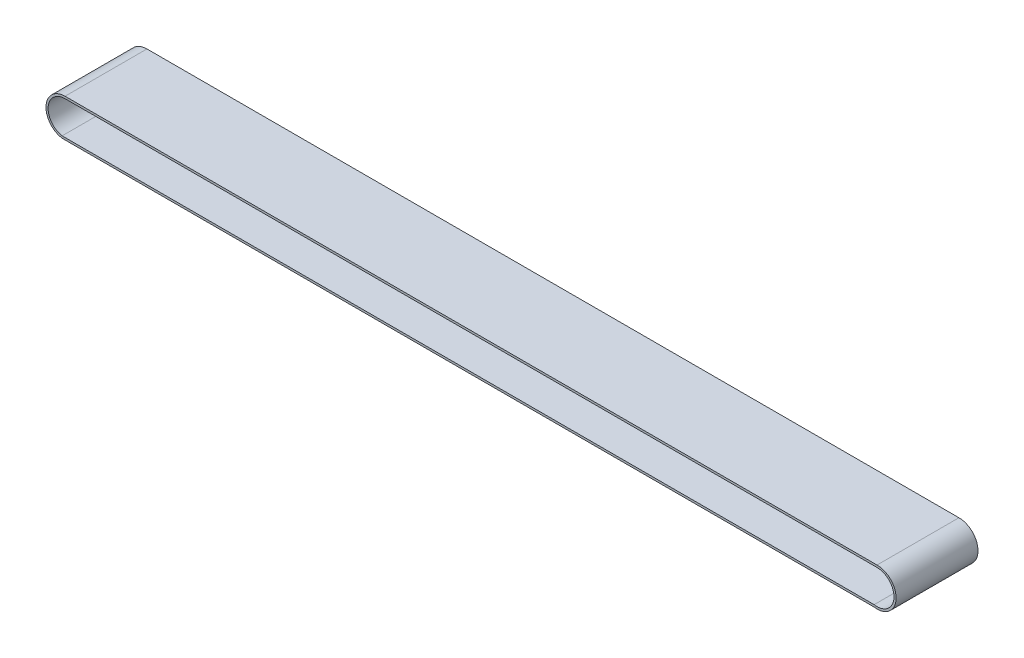
ISO-10303-21;
HEADER;
FILE_DESCRIPTION(('STEP AP214'),'2;1');
FILE_NAME('part.step','',(''),(''),'','','');
FILE_SCHEMA(('AUTOMOTIVE_DESIGN { 1 0 10303 214 1 1 1 1 }'));
ENDSEC;
DATA;
#1=APPLICATION_CONTEXT('core data for automotive mechanical design processes');
#2=APPLICATION_PROTOCOL_DEFINITION('international standard','automotive_design',2000,#1);
#3=PRODUCT_CONTEXT('',#1,'mechanical');
#4=PRODUCT('Part','Part','',(#3));
#5=PRODUCT_RELATED_PRODUCT_CATEGORY('part','',(#4));
#6=PRODUCT_DEFINITION_FORMATION('','',#4);
#7=PRODUCT_DEFINITION_CONTEXT('part definition',#1,'design');
#8=PRODUCT_DEFINITION('design','',#6,#7);
#9=PRODUCT_DEFINITION_SHAPE('','',#8);
#10=(LENGTH_UNIT() NAMED_UNIT(*) SI_UNIT(.MILLI.,.METRE.));
#11=(NAMED_UNIT(*) PLANE_ANGLE_UNIT() SI_UNIT($,.RADIAN.));
#12=(NAMED_UNIT(*) SI_UNIT($,.STERADIAN.) SOLID_ANGLE_UNIT());
#13=UNCERTAINTY_MEASURE_WITH_UNIT(LENGTH_MEASURE(1.E-05),#10,'distance_accuracy_value','');
#14=(GEOMETRIC_REPRESENTATION_CONTEXT(3) GLOBAL_UNCERTAINTY_ASSIGNED_CONTEXT((#13)) GLOBAL_UNIT_ASSIGNED_CONTEXT((#10,
#11,#12)) REPRESENTATION_CONTEXT('',''));
#15=CARTESIAN_POINT('',(0.,0.,0.));
#16=DIRECTION('',(0.,0.,1.));
#17=DIRECTION('',(1.,0.,0.));
#18=AXIS2_PLACEMENT_3D('',#15,#16,#17);
#19=CARTESIAN_POINT('',(288.592886812432,-0.0890617466296167,29.));
#20=DIRECTION('',(0.,0.,-1.));
#21=DIRECTION('',(-1.,0.,0.));
#22=AXIS2_PLACEMENT_3D('',#19,#20,#21);
#23=CYLINDRICAL_SURFACE('',#22,13.5);
#24=CARTESIAN_POINT('',(288.592886812432,-0.0890617466296167,-29.));
#25=DIRECTION('',(0.,0.,1.));
#26=DIRECTION('',(1.,0.,0.));
#27=AXIS2_PLACEMENT_3D('',#24,#25,#26);
#28=CIRCLE('',#27,13.5);
#29=CARTESIAN_POINT('',(286.407113187568,-13.4109382533704,-29.));
#30=VERTEX_POINT('',#29);
#31=CARTESIAN_POINT('',(288.592886812432,13.4109382533704,-29.));
#32=VERTEX_POINT('',#31);
#33=EDGE_CURVE('E169',#30,#32,#28,.T.);
#34=ORIENTED_EDGE('',*,*,#33,.T.);
#35=DIRECTION('',(0.,0.,-1.));
#36=VECTOR('',#35,1.);
#37=CARTESIAN_POINT('',(288.592886812432,13.4109382533704,29.));
#38=LINE('',#37,#36);
#39=CARTESIAN_POINT('',(288.592886812432,13.4109382533704,29.));
#40=VERTEX_POINT('',#39);
#41=EDGE_CURVE('E11',#40,#32,#38,.T.);
#42=ORIENTED_EDGE('',*,*,#41,.F.);
#43=CARTESIAN_POINT('',(288.592886812432,-0.0890617466296167,29.));
#44=DIRECTION('',(0.,0.,1.));
#45=DIRECTION('',(1.,0.,0.));
#46=AXIS2_PLACEMENT_3D('',#43,#44,#45);
#47=CIRCLE('',#46,13.5);
#48=CARTESIAN_POINT('',(286.407113187568,-13.4109382533704,29.));
#49=VERTEX_POINT('',#48);
#50=EDGE_CURVE('E154',#49,#40,#47,.T.);
#51=ORIENTED_EDGE('',*,*,#50,.F.);
#52=DIRECTION('',(0.,0.,-1.));
#53=VECTOR('',#52,1.);
#54=CARTESIAN_POINT('',(286.407113187568,-13.4109382533704,29.));
#55=LINE('',#54,#53);
#56=EDGE_CURVE('E168',#49,#30,#55,.T.);
#57=ORIENTED_EDGE('',*,*,#56,.T.);
#58=EDGE_LOOP('',(#34,#42,#51,#57));
#59=FACE_BOUND('',#58,.T.);
#60=ADVANCED_FACE('F47',(#59),#23,.T.);
#61=CARTESIAN_POINT('',(-286.407113187568,13.4109382533704,29.));
#62=DIRECTION('',(0.,-1.,0.));
#63=DIRECTION('',(0.,0.,-1.));
#64=AXIS2_PLACEMENT_3D('',#61,#62,#63);
#65=PLANE('',#64);
#66=DIRECTION('',(-1.,0.,0.));
#67=VECTOR('',#66,1.);
#68=CARTESIAN_POINT('',(-286.407113187568,13.4109382533704,-29.));
#69=LINE('',#68,#67);
#70=CARTESIAN_POINT('',(-286.407113187568,13.4109382533704,-29.));
#71=VERTEX_POINT('',#70);
#72=EDGE_CURVE('E173',#32,#71,#69,.T.);
#73=ORIENTED_EDGE('',*,*,#72,.T.);
#74=DIRECTION('',(0.,0.,-1.));
#75=VECTOR('',#74,1.);
#76=CARTESIAN_POINT('',(-286.407113187568,13.4109382533704,29.));
#77=LINE('',#76,#75);
#78=CARTESIAN_POINT('',(-286.407113187568,13.4109382533704,29.));
#79=VERTEX_POINT('',#78);
#80=EDGE_CURVE('E55',#79,#71,#77,.T.);
#81=ORIENTED_EDGE('',*,*,#80,.F.);
#82=DIRECTION('',(-1.,0.,0.));
#83=VECTOR('',#82,1.);
#84=CARTESIAN_POINT('',(-286.407113187568,13.4109382533704,29.));
#85=LINE('',#84,#83);
#86=EDGE_CURVE('E158',#40,#79,#85,.T.);
#87=ORIENTED_EDGE('',*,*,#86,.F.);
#88=ORIENTED_EDGE('',*,*,#41,.T.);
#89=EDGE_LOOP('',(#73,#81,#87,#88));
#90=FACE_BOUND('',#89,.T.);
#91=ADVANCED_FACE('F207',(#90),#65,.F.);
#92=CARTESIAN_POINT('',(-286.407113187568,-0.0890617466296162,29.));
#93=DIRECTION('',(0.,0.,-1.));
#94=DIRECTION('',(-1.,0.,0.));
#95=AXIS2_PLACEMENT_3D('',#92,#93,#94);
#96=CYLINDRICAL_SURFACE('',#95,13.5);
#97=CARTESIAN_POINT('',(-286.407113187568,-0.0890617466296162,-29.));
#98=DIRECTION('',(0.,0.,1.));
#99=DIRECTION('',(1.,0.,0.));
#100=AXIS2_PLACEMENT_3D('',#97,#98,#99);
#101=CIRCLE('',#100,13.5);
#102=CARTESIAN_POINT('',(-288.592886812432,-13.4109382533704,-29.));
#103=VERTEX_POINT('',#102);
#104=EDGE_CURVE('E176',#71,#103,#101,.T.);
#105=ORIENTED_EDGE('',*,*,#104,.T.);
#106=DIRECTION('',(0.,0.,-1.));
#107=VECTOR('',#106,1.);
#108=CARTESIAN_POINT('',(-288.592886812432,-13.4109382533704,29.));
#109=LINE('',#108,#107);
#110=CARTESIAN_POINT('',(-288.592886812432,-13.4109382533704,29.));
#111=VERTEX_POINT('',#110);
#112=EDGE_CURVE('E184',#111,#103,#109,.T.);
#113=ORIENTED_EDGE('',*,*,#112,.F.);
#114=CARTESIAN_POINT('',(-286.407113187568,-0.0890617466296162,29.));
#115=DIRECTION('',(0.,0.,1.));
#116=DIRECTION('',(1.,0.,0.));
#117=AXIS2_PLACEMENT_3D('',#114,#115,#116);
#118=CIRCLE('',#117,13.5);
#119=EDGE_CURVE('E162',#79,#111,#118,.T.);
#120=ORIENTED_EDGE('',*,*,#119,.F.);
#121=ORIENTED_EDGE('',*,*,#80,.T.);
#122=EDGE_LOOP('',(#105,#113,#120,#121));
#123=FACE_BOUND('',#122,.T.);
#124=ADVANCED_FACE('F193',(#123),#96,.T.);
#125=CARTESIAN_POINT('',(-288.592886812432,-13.4109382533704,29.));
#126=DIRECTION('',(0.,1.,0.));
#127=DIRECTION('',(-1.,0.,0.));
#128=AXIS2_PLACEMENT_3D('',#125,#126,#127);
#129=PLANE('',#128);
#130=DIRECTION('',(1.,0.,0.));
#131=VECTOR('',#130,1.);
#132=CARTESIAN_POINT('',(-288.592886812432,-13.4109382533704,-29.));
#133=LINE('',#132,#131);
#134=EDGE_CURVE('E159',#103,#30,#133,.T.);
#135=ORIENTED_EDGE('',*,*,#134,.T.);
#136=ORIENTED_EDGE('',*,*,#56,.F.);
#137=DIRECTION('',(1.,0.,0.));
#138=VECTOR('',#137,1.);
#139=CARTESIAN_POINT('',(-288.592886812432,-13.4109382533704,29.));
#140=LINE('',#139,#138);
#141=EDGE_CURVE('E165',#111,#49,#140,.T.);
#142=ORIENTED_EDGE('',*,*,#141,.F.);
#143=ORIENTED_EDGE('',*,*,#112,.T.);
#144=EDGE_LOOP('',(#135,#136,#142,#143));
#145=FACE_BOUND('',#144,.T.);
#146=ADVANCED_FACE('F200',(#145),#129,.F.);
#147=CARTESIAN_POINT('',(288.592886812432,-0.0890617466296167,29.));
#148=DIRECTION('',(0.,0.,1.));
#149=DIRECTION('',(1.,0.,0.));
#150=AXIS2_PLACEMENT_3D('',#147,#148,#149);
#151=PLANE('',#150);
#152=CARTESIAN_POINT('',(288.592886812432,-0.0890617466296167,29.));
#153=DIRECTION('',(0.,0.,1.));
#154=DIRECTION('',(1.,0.,0.));
#155=AXIS2_PLACEMENT_3D('',#152,#153,#154);
#156=CIRCLE('',#155,12.);
#157=CARTESIAN_POINT('',(286.532975197973,-11.9109382533704,29.));
#158=VERTEX_POINT('',#157);
#159=CARTESIAN_POINT('',(288.592886812431,11.9109382533704,29.));
#160=VERTEX_POINT('',#159);
#161=EDGE_CURVE('E136',#158,#160,#156,.T.);
#162=ORIENTED_EDGE('',*,*,#161,.F.);
#163=DIRECTION('',(1.,0.,0.));
#164=VECTOR('',#163,1.);
#165=CARTESIAN_POINT('',(-288.592886812432,-11.9109382533704,29.));
#166=LINE('',#165,#164);
#167=CARTESIAN_POINT('',(-288.467024802027,-11.9109382533704,29.));
#168=VERTEX_POINT('',#167);
#169=EDGE_CURVE('E117',#168,#158,#166,.T.);
#170=ORIENTED_EDGE('',*,*,#169,.F.);
#171=CARTESIAN_POINT('',(-286.407113187568,-0.0890617466296162,29.));
#172=DIRECTION('',(0.,0.,1.));
#173=DIRECTION('',(1.,0.,0.));
#174=AXIS2_PLACEMENT_3D('',#171,#172,#173);
#175=CIRCLE('',#174,12.);
#176=CARTESIAN_POINT('',(-286.407113187568,11.9109382533704,29.));
#177=VERTEX_POINT('',#176);
#178=EDGE_CURVE('E149',#177,#168,#175,.T.);
#179=ORIENTED_EDGE('',*,*,#178,.F.);
#180=DIRECTION('',(-1.,0.,0.));
#181=VECTOR('',#180,1.);
#182=CARTESIAN_POINT('',(-286.407113187568,11.9109382533704,29.));
#183=LINE('',#182,#181);
#184=EDGE_CURVE('E140',#160,#177,#183,.T.);
#185=ORIENTED_EDGE('',*,*,#184,.F.);
#186=EDGE_LOOP('',(#162,#170,#179,#185));
#187=FACE_BOUND('',#186,.T.);
#188=ORIENTED_EDGE('',*,*,#50,.T.);
#189=ORIENTED_EDGE('',*,*,#86,.T.);
#190=ORIENTED_EDGE('',*,*,#119,.T.);
#191=ORIENTED_EDGE('',*,*,#141,.T.);
#192=EDGE_LOOP('',(#188,#189,#190,#191));
#193=FACE_BOUND('',#192,.T.);
#194=ADVANCED_FACE('F206',(#187,#193),#151,.T.);
#195=CARTESIAN_POINT('',(288.592886812432,-0.0890617466296167,-29.));
#196=DIRECTION('',(0.,0.,1.));
#197=DIRECTION('',(1.,0.,0.));
#198=AXIS2_PLACEMENT_3D('',#195,#196,#197);
#199=PLANE('',#198);
#200=DIRECTION('',(1.,0.,0.));
#201=VECTOR('',#200,1.);
#202=CARTESIAN_POINT('',(-288.592886812432,-11.9109382533704,-29.));
#203=LINE('',#202,#201);
#204=CARTESIAN_POINT('',(-288.467024802027,-11.9109382533704,-29.));
#205=VERTEX_POINT('',#204);
#206=CARTESIAN_POINT('',(286.532975197973,-11.9109382533704,-29.));
#207=VERTEX_POINT('',#206);
#208=EDGE_CURVE('E115',#205,#207,#203,.T.);
#209=ORIENTED_EDGE('',*,*,#208,.T.);
#210=CARTESIAN_POINT('',(288.592886812432,-0.0890617466296167,-29.));
#211=DIRECTION('',(0.,0.,1.));
#212=DIRECTION('',(1.,0.,0.));
#213=AXIS2_PLACEMENT_3D('',#210,#211,#212);
#214=CIRCLE('',#213,12.);
#215=CARTESIAN_POINT('',(288.592886812431,11.9109382533704,-29.));
#216=VERTEX_POINT('',#215);
#217=EDGE_CURVE('E124',#207,#216,#214,.T.);
#218=ORIENTED_EDGE('',*,*,#217,.T.);
#219=DIRECTION('',(-1.,0.,0.));
#220=VECTOR('',#219,1.);
#221=CARTESIAN_POINT('',(-286.407113187568,11.9109382533704,-29.));
#222=LINE('',#221,#220);
#223=CARTESIAN_POINT('',(-286.407113187568,11.9109382533704,-29.));
#224=VERTEX_POINT('',#223);
#225=EDGE_CURVE('E131',#216,#224,#222,.T.);
#226=ORIENTED_EDGE('',*,*,#225,.T.);
#227=CARTESIAN_POINT('',(-286.407113187568,-0.0890617466296162,-29.));
#228=DIRECTION('',(0.,0.,1.));
#229=DIRECTION('',(1.,0.,0.));
#230=AXIS2_PLACEMENT_3D('',#227,#228,#229);
#231=CIRCLE('',#230,12.);
#232=EDGE_CURVE('E69',#224,#205,#231,.T.);
#233=ORIENTED_EDGE('',*,*,#232,.T.);
#234=EDGE_LOOP('',(#209,#218,#226,#233));
#235=FACE_BOUND('',#234,.T.);
#236=ORIENTED_EDGE('',*,*,#33,.F.);
#237=ORIENTED_EDGE('',*,*,#134,.F.);
#238=ORIENTED_EDGE('',*,*,#104,.F.);
#239=ORIENTED_EDGE('',*,*,#72,.F.);
#240=EDGE_LOOP('',(#236,#237,#238,#239));
#241=FACE_BOUND('',#240,.T.);
#242=ADVANCED_FACE('F133',(#235,#241),#199,.F.);
#243=CARTESIAN_POINT('',(288.592886812432,-0.0890617466296167,29.));
#244=DIRECTION('',(0.,0.,-1.));
#245=DIRECTION('',(-1.,0.,0.));
#246=AXIS2_PLACEMENT_3D('',#243,#244,#245);
#247=CYLINDRICAL_SURFACE('',#246,12.);
#248=ORIENTED_EDGE('',*,*,#217,.F.);
#249=DIRECTION('',(0.,0.,-1.));
#250=VECTOR('',#249,1.);
#251=CARTESIAN_POINT('',(286.532975197973,-11.9109382533704,29.));
#252=LINE('',#251,#250);
#253=EDGE_CURVE('E111',#158,#207,#252,.T.);
#254=ORIENTED_EDGE('',*,*,#253,.F.);
#255=ORIENTED_EDGE('',*,*,#161,.T.);
#256=DIRECTION('',(0.,0.,-1.));
#257=VECTOR('',#256,1.);
#258=CARTESIAN_POINT('',(288.592886812431,11.9109382533704,29.));
#259=LINE('',#258,#257);
#260=EDGE_CURVE('E127',#160,#216,#259,.T.);
#261=ORIENTED_EDGE('',*,*,#260,.T.);
#262=EDGE_LOOP('',(#248,#254,#255,#261));
#263=FACE_BOUND('',#262,.T.);
#264=ADVANCED_FACE('F125',(#263),#247,.F.);
#265=CARTESIAN_POINT('',(-286.407113187568,11.9109382533704,29.));
#266=DIRECTION('',(0.,-1.,0.));
#267=DIRECTION('',(0.,0.,-1.));
#268=AXIS2_PLACEMENT_3D('',#265,#266,#267);
#269=PLANE('',#268);
#270=ORIENTED_EDGE('',*,*,#225,.F.);
#271=ORIENTED_EDGE('',*,*,#260,.F.);
#272=ORIENTED_EDGE('',*,*,#184,.T.);
#273=DIRECTION('',(0.,0.,-1.));
#274=VECTOR('',#273,1.);
#275=CARTESIAN_POINT('',(-286.407113187568,11.9109382533704,29.));
#276=LINE('',#275,#274);
#277=EDGE_CURVE('E291',#177,#224,#276,.T.);
#278=ORIENTED_EDGE('',*,*,#277,.T.);
#279=EDGE_LOOP('',(#270,#271,#272,#278));
#280=FACE_BOUND('',#279,.T.);
#281=ADVANCED_FACE('F227',(#280),#269,.T.);
#282=CARTESIAN_POINT('',(-286.407113187568,-0.0890617466296162,29.));
#283=DIRECTION('',(0.,0.,-1.));
#284=DIRECTION('',(-1.,0.,0.));
#285=AXIS2_PLACEMENT_3D('',#282,#283,#284);
#286=CYLINDRICAL_SURFACE('',#285,12.);
#287=ORIENTED_EDGE('',*,*,#232,.F.);
#288=ORIENTED_EDGE('',*,*,#277,.F.);
#289=ORIENTED_EDGE('',*,*,#178,.T.);
#290=DIRECTION('',(0.,0.,-1.));
#291=VECTOR('',#290,1.);
#292=CARTESIAN_POINT('',(-288.467024802027,-11.9109382533704,29.));
#293=LINE('',#292,#291);
#294=EDGE_CURVE('E62',#168,#205,#293,.T.);
#295=ORIENTED_EDGE('',*,*,#294,.T.);
#296=EDGE_LOOP('',(#287,#288,#289,#295));
#297=FACE_BOUND('',#296,.T.);
#298=ADVANCED_FACE('F224',(#297),#286,.F.);
#299=CARTESIAN_POINT('',(-288.592886812432,-11.9109382533704,29.));
#300=DIRECTION('',(0.,1.,0.));
#301=DIRECTION('',(-1.,0.,0.));
#302=AXIS2_PLACEMENT_3D('',#299,#300,#301);
#303=PLANE('',#302);
#304=ORIENTED_EDGE('',*,*,#208,.F.);
#305=ORIENTED_EDGE('',*,*,#294,.F.);
#306=ORIENTED_EDGE('',*,*,#169,.T.);
#307=ORIENTED_EDGE('',*,*,#253,.T.);
#308=EDGE_LOOP('',(#304,#305,#306,#307));
#309=FACE_BOUND('',#308,.T.);
#310=ADVANCED_FACE('F113',(#309),#303,.T.);
#311=CLOSED_SHELL('',(#60,#91,#124,#146,#194,#242,#264,#281,#298,#310));
#312=MANIFOLD_SOLID_BREP('B2',#311);
#313=ADVANCED_BREP_SHAPE_REPRESENTATION('',(#18,#312),#14);
#314=SHAPE_DEFINITION_REPRESENTATION(#9,#313);
ENDSEC;
END-ISO-10303-21;
